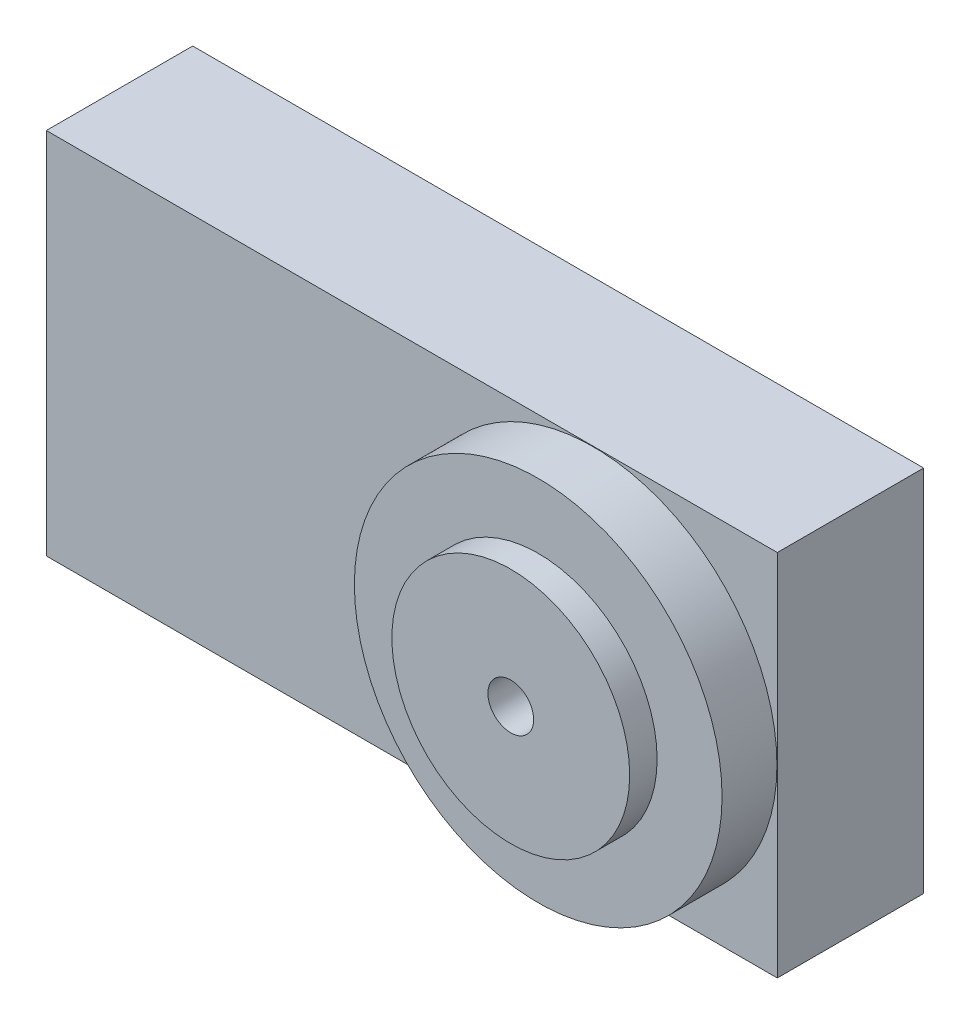
ISO-10303-21;
HEADER;
FILE_DESCRIPTION(('STEP AP214'),'2;1');
FILE_NAME('part.step','',(''),(''),'','','');
FILE_SCHEMA(('AUTOMOTIVE_DESIGN { 1 0 10303 214 1 1 1 1 }'));
ENDSEC;
DATA;
#1=APPLICATION_CONTEXT('core data for automotive mechanical design processes');
#2=APPLICATION_PROTOCOL_DEFINITION('international standard','automotive_design',2000,#1);
#3=PRODUCT_CONTEXT('',#1,'mechanical');
#4=PRODUCT('Part','Part','',(#3));
#5=PRODUCT_RELATED_PRODUCT_CATEGORY('part','',(#4));
#6=PRODUCT_DEFINITION_FORMATION('','',#4);
#7=PRODUCT_DEFINITION_CONTEXT('part definition',#1,'design');
#8=PRODUCT_DEFINITION('design','',#6,#7);
#9=PRODUCT_DEFINITION_SHAPE('','',#8);
#10=(LENGTH_UNIT() NAMED_UNIT(*) SI_UNIT(.MILLI.,.METRE.));
#11=(NAMED_UNIT(*) PLANE_ANGLE_UNIT() SI_UNIT($,.RADIAN.));
#12=(NAMED_UNIT(*) SI_UNIT($,.STERADIAN.) SOLID_ANGLE_UNIT());
#13=UNCERTAINTY_MEASURE_WITH_UNIT(LENGTH_MEASURE(1.E-05),#10,'distance_accuracy_value','');
#14=(GEOMETRIC_REPRESENTATION_CONTEXT(3) GLOBAL_UNCERTAINTY_ASSIGNED_CONTEXT((#13)) GLOBAL_UNIT_ASSIGNED_CONTEXT((#10,
#11,#12)) REPRESENTATION_CONTEXT('',''));
#15=CARTESIAN_POINT('',(0.,0.,0.));
#16=DIRECTION('',(0.,0.,1.));
#17=DIRECTION('',(1.,0.,0.));
#18=AXIS2_PLACEMENT_3D('',#15,#16,#17);
#19=CARTESIAN_POINT('',(45.6675485561145,-126.096678602438,8.));
#20=DIRECTION('',(-1.,0.,0.));
#21=DIRECTION('',(0.,0.,1.));
#22=AXIS2_PLACEMENT_3D('',#19,#20,#21);
#23=PLANE('',#22);
#24=DIRECTION('',(0.,1.,0.));
#25=VECTOR('',#24,1.);
#26=CARTESIAN_POINT('',(45.6675485561145,-126.096678602438,0.));
#27=LINE('',#26,#25);
#28=CARTESIAN_POINT('',(45.6675485561145,-126.096678602438,0.));
#29=VERTEX_POINT('',#28);
#30=CARTESIAN_POINT('',(45.6675485561145,-105.95309397634,0.));
#31=VERTEX_POINT('',#30);
#32=EDGE_CURVE('E101',#29,#31,#27,.T.);
#33=ORIENTED_EDGE('',*,*,#32,.T.);
#34=DIRECTION('',(0.,0.,-1.));
#35=VECTOR('',#34,1.);
#36=CARTESIAN_POINT('',(45.6675485561145,-105.95309397634,8.));
#37=LINE('',#36,#35);
#38=CARTESIAN_POINT('',(45.6675485561145,-105.95309397634,8.));
#39=VERTEX_POINT('',#38);
#40=EDGE_CURVE('E37',#39,#31,#37,.T.);
#41=ORIENTED_EDGE('',*,*,#40,.F.);
#42=DIRECTION('',(0.,1.,0.));
#43=VECTOR('',#42,1.);
#44=CARTESIAN_POINT('',(45.6675485561145,-126.096678602438,8.));
#45=LINE('',#44,#43);
#46=CARTESIAN_POINT('',(45.6675485561145,-126.096678602438,8.));
#47=VERTEX_POINT('',#46);
#48=EDGE_CURVE('E88',#47,#39,#45,.T.);
#49=ORIENTED_EDGE('',*,*,#48,.F.);
#50=DIRECTION('',(0.,0.,-1.));
#51=VECTOR('',#50,1.);
#52=CARTESIAN_POINT('',(45.6675485561145,-126.096678602438,8.));
#53=LINE('',#52,#51);
#54=EDGE_CURVE('E97',#47,#29,#53,.T.);
#55=ORIENTED_EDGE('',*,*,#54,.T.);
#56=EDGE_LOOP('',(#33,#41,#49,#55));
#57=FACE_BOUND('',#56,.T.);
#58=ADVANCED_FACE('F34',(#57),#23,.F.);
#59=CARTESIAN_POINT('',(45.6675485561145,-105.95309397634,8.));
#60=DIRECTION('',(0.,-1.,0.));
#61=DIRECTION('',(0.,0.,-1.));
#62=AXIS2_PLACEMENT_3D('',#59,#60,#61);
#63=PLANE('',#62);
#64=DIRECTION('',(-1.,0.,0.));
#65=VECTOR('',#64,1.);
#66=CARTESIAN_POINT('',(45.6675485561145,-105.95309397634,0.));
#67=LINE('',#66,#65);
#68=CARTESIAN_POINT('',(5.70942067777518,-105.95309397634,0.));
#69=VERTEX_POINT('',#68);
#70=EDGE_CURVE('E93',#31,#69,#67,.T.);
#71=ORIENTED_EDGE('',*,*,#70,.T.);
#72=DIRECTION('',(0.,0.,-1.));
#73=VECTOR('',#72,1.);
#74=CARTESIAN_POINT('',(5.70942067777518,-105.95309397634,8.));
#75=LINE('',#74,#73);
#76=CARTESIAN_POINT('',(5.70942067777518,-105.95309397634,8.));
#77=VERTEX_POINT('',#76);
#78=EDGE_CURVE('E91',#77,#69,#75,.T.);
#79=ORIENTED_EDGE('',*,*,#78,.F.);
#80=DIRECTION('',(-1.,0.,0.));
#81=VECTOR('',#80,1.);
#82=CARTESIAN_POINT('',(45.6675485561145,-105.95309397634,8.));
#83=LINE('',#82,#81);
#84=EDGE_CURVE('E83',#39,#77,#83,.T.);
#85=ORIENTED_EDGE('',*,*,#84,.F.);
#86=ORIENTED_EDGE('',*,*,#40,.T.);
#87=EDGE_LOOP('',(#71,#79,#85,#86));
#88=FACE_BOUND('',#87,.T.);
#89=ADVANCED_FACE('F92',(#88),#63,.F.);
#90=CARTESIAN_POINT('',(5.70942067777518,-126.096678602438,8.));
#91=DIRECTION('',(1.,0.,0.));
#92=DIRECTION('',(0.,0.,-1.));
#93=AXIS2_PLACEMENT_3D('',#90,#91,#92);
#94=PLANE('',#93);
#95=DIRECTION('',(0.,-1.,0.));
#96=VECTOR('',#95,1.);
#97=CARTESIAN_POINT('',(5.70942067777518,-126.096678602438,0.));
#98=LINE('',#97,#96);
#99=CARTESIAN_POINT('',(5.70942067777518,-126.096678602438,0.));
#100=VERTEX_POINT('',#99);
#101=EDGE_CURVE('E69',#69,#100,#98,.T.);
#102=ORIENTED_EDGE('',*,*,#101,.T.);
#103=DIRECTION('',(0.,0.,-1.));
#104=VECTOR('',#103,1.);
#105=CARTESIAN_POINT('',(5.70942067777518,-126.096678602438,8.));
#106=LINE('',#105,#104);
#107=CARTESIAN_POINT('',(5.70942067777518,-126.096678602438,8.));
#108=VERTEX_POINT('',#107);
#109=EDGE_CURVE('E94',#108,#100,#106,.T.);
#110=ORIENTED_EDGE('',*,*,#109,.F.);
#111=DIRECTION('',(0.,-1.,0.));
#112=VECTOR('',#111,1.);
#113=CARTESIAN_POINT('',(5.70942067777518,-126.096678602438,8.));
#114=LINE('',#113,#112);
#115=EDGE_CURVE('E86',#77,#108,#114,.T.);
#116=ORIENTED_EDGE('',*,*,#115,.F.);
#117=ORIENTED_EDGE('',*,*,#78,.T.);
#118=EDGE_LOOP('',(#102,#110,#116,#117));
#119=FACE_BOUND('',#118,.T.);
#120=ADVANCED_FACE('F95',(#119),#94,.F.);
#121=CARTESIAN_POINT('',(45.6675485561145,-126.096678602438,8.));
#122=DIRECTION('',(0.,1.,0.));
#123=DIRECTION('',(0.,0.,1.));
#124=AXIS2_PLACEMENT_3D('',#121,#122,#123);
#125=PLANE('',#124);
#126=DIRECTION('',(1.,0.,0.));
#127=VECTOR('',#126,1.);
#128=CARTESIAN_POINT('',(45.6675485561145,-126.096678602438,0.));
#129=LINE('',#128,#127);
#130=EDGE_CURVE('E75',#100,#29,#129,.T.);
#131=ORIENTED_EDGE('',*,*,#130,.T.);
#132=ORIENTED_EDGE('',*,*,#54,.F.);
#133=DIRECTION('',(1.,0.,0.));
#134=VECTOR('',#133,1.);
#135=CARTESIAN_POINT('',(45.6675485561145,-126.096678602438,8.));
#136=LINE('',#135,#134);
#137=EDGE_CURVE('E52',#108,#47,#136,.T.);
#138=ORIENTED_EDGE('',*,*,#137,.F.);
#139=ORIENTED_EDGE('',*,*,#109,.T.);
#140=EDGE_LOOP('',(#131,#132,#138,#139));
#141=FACE_BOUND('',#140,.T.);
#142=ADVANCED_FACE('F109',(#141),#125,.F.);
#143=CARTESIAN_POINT('',(0.,0.,8.));
#144=DIRECTION('',(0.,0.,1.));
#145=DIRECTION('',(1.,0.,0.));
#146=AXIS2_PLACEMENT_3D('',#143,#144,#145);
#147=PLANE('',#146);
#148=CARTESIAN_POINT('',(35.5975485561146,-116.024886289389,8.));
#149=DIRECTION('',(0.,0.,1.));
#150=DIRECTION('',(1.,0.,0.));
#151=AXIS2_PLACEMENT_3D('',#148,#149,#150);
#152=CIRCLE('',#151,10.0497806213995);
#153=CARTESIAN_POINT('',(45.647329177514,-116.024886289389,8.));
#154=VERTEX_POINT('',#153);
#155=EDGE_CURVE('E43',#154,#154,#152,.T.);
#156=ORIENTED_EDGE('',*,*,#155,.F.);
#157=EDGE_LOOP('',(#156));
#158=FACE_BOUND('',#157,.T.);
#159=ORIENTED_EDGE('',*,*,#48,.T.);
#160=ORIENTED_EDGE('',*,*,#84,.T.);
#161=ORIENTED_EDGE('',*,*,#115,.T.);
#162=ORIENTED_EDGE('',*,*,#137,.T.);
#163=EDGE_LOOP('',(#159,#160,#161,#162));
#164=FACE_BOUND('',#163,.T.);
#165=ADVANCED_FACE('F84',(#158,#164),#147,.T.);
#166=CARTESIAN_POINT('',(0.,0.,0.));
#167=DIRECTION('',(0.,0.,1.));
#168=DIRECTION('',(1.,0.,0.));
#169=AXIS2_PLACEMENT_3D('',#166,#167,#168);
#170=PLANE('',#169);
#171=ORIENTED_EDGE('',*,*,#32,.F.);
#172=ORIENTED_EDGE('',*,*,#130,.F.);
#173=ORIENTED_EDGE('',*,*,#101,.F.);
#174=ORIENTED_EDGE('',*,*,#70,.F.);
#175=EDGE_LOOP('',(#171,#172,#173,#174));
#176=FACE_BOUND('',#175,.T.);
#177=ADVANCED_FACE('F112',(#176),#170,.F.);
#178=CARTESIAN_POINT('',(35.5975485561146,-116.024886289389,11.));
#179=DIRECTION('',(0.,0.,-1.));
#180=DIRECTION('',(-1.,0.,0.));
#181=AXIS2_PLACEMENT_3D('',#178,#179,#180);
#182=CYLINDRICAL_SURFACE('',#181,10.0497806213995);
#183=CARTESIAN_POINT('',(35.5975485561146,-116.024886289389,11.));
#184=DIRECTION('',(0.,0.,1.));
#185=DIRECTION('',(1.,0.,0.));
#186=AXIS2_PLACEMENT_3D('',#183,#184,#185);
#187=CIRCLE('',#186,10.0497806213995);
#188=CARTESIAN_POINT('',(45.647329177514,-116.024886289389,11.));
#189=VERTEX_POINT('',#188);
#190=EDGE_CURVE('E104',#189,#189,#187,.T.);
#191=ORIENTED_EDGE('',*,*,#190,.F.);
#192=EDGE_LOOP('',(#191));
#193=FACE_BOUND('',#192,.T.);
#194=ORIENTED_EDGE('',*,*,#155,.T.);
#195=EDGE_LOOP('',(#194));
#196=FACE_BOUND('',#195,.T.);
#197=ADVANCED_FACE('F152',(#193,#196),#182,.T.);
#198=CARTESIAN_POINT('',(35.5975485561146,-116.024886289389,11.));
#199=DIRECTION('',(0.,0.,1.));
#200=DIRECTION('',(1.,0.,0.));
#201=AXIS2_PLACEMENT_3D('',#198,#199,#200);
#202=PLANE('',#201);
#203=CARTESIAN_POINT('',(35.5975485561146,-116.024886289389,11.));
#204=DIRECTION('',(0.,0.,1.));
#205=DIRECTION('',(1.,0.,0.));
#206=AXIS2_PLACEMENT_3D('',#203,#204,#205);
#207=CIRCLE('',#206,6.5);
#208=CARTESIAN_POINT('',(42.0975485561146,-116.024886289389,11.));
#209=VERTEX_POINT('',#208);
#210=EDGE_CURVE('E11',#209,#209,#207,.T.);
#211=ORIENTED_EDGE('',*,*,#210,.F.);
#212=EDGE_LOOP('',(#211));
#213=FACE_BOUND('',#212,.T.);
#214=ORIENTED_EDGE('',*,*,#190,.T.);
#215=EDGE_LOOP('',(#214));
#216=FACE_BOUND('',#215,.T.);
#217=ADVANCED_FACE('F146',(#213,#216),#202,.T.);
#218=CARTESIAN_POINT('',(35.5975485561146,-116.024886289389,12.5));
#219=DIRECTION('',(0.,0.,-1.));
#220=DIRECTION('',(-1.,0.,0.));
#221=AXIS2_PLACEMENT_3D('',#218,#219,#220);
#222=CYLINDRICAL_SURFACE('',#221,6.5);
#223=CARTESIAN_POINT('',(35.5975485561146,-116.024886289389,12.5));
#224=DIRECTION('',(0.,0.,1.));
#225=DIRECTION('',(1.,0.,0.));
#226=AXIS2_PLACEMENT_3D('',#223,#224,#225);
#227=CIRCLE('',#226,6.5);
#228=CARTESIAN_POINT('',(42.0975485561146,-116.024886289389,12.5));
#229=VERTEX_POINT('',#228);
#230=EDGE_CURVE('E118',#229,#229,#227,.T.);
#231=ORIENTED_EDGE('',*,*,#230,.F.);
#232=EDGE_LOOP('',(#231));
#233=FACE_BOUND('',#232,.T.);
#234=ORIENTED_EDGE('',*,*,#210,.T.);
#235=EDGE_LOOP('',(#234));
#236=FACE_BOUND('',#235,.T.);
#237=ADVANCED_FACE('F140',(#233,#236),#222,.T.);
#238=CARTESIAN_POINT('',(35.5975485561146,-116.024886289389,12.5));
#239=DIRECTION('',(0.,0.,1.));
#240=DIRECTION('',(1.,0.,0.));
#241=AXIS2_PLACEMENT_3D('',#238,#239,#240);
#242=PLANE('',#241);
#243=CARTESIAN_POINT('',(35.5975485561146,-116.024886289389,12.5));
#244=DIRECTION('',(0.,0.,1.));
#245=DIRECTION('',(1.,0.,0.));
#246=AXIS2_PLACEMENT_3D('',#243,#244,#245);
#247=CIRCLE('',#246,1.25);
#248=CARTESIAN_POINT('',(36.8475485561146,-116.024886289389,12.5));
#249=VERTEX_POINT('',#248);
#250=EDGE_CURVE('E123',#249,#249,#247,.T.);
#251=ORIENTED_EDGE('',*,*,#250,.F.);
#252=EDGE_LOOP('',(#251));
#253=FACE_BOUND('',#252,.T.);
#254=ORIENTED_EDGE('',*,*,#230,.T.);
#255=EDGE_LOOP('',(#254));
#256=FACE_BOUND('',#255,.T.);
#257=ADVANCED_FACE('F134',(#253,#256),#242,.T.);
#258=CARTESIAN_POINT('',(35.5975485561146,-116.024886289389,7.5));
#259=DIRECTION('',(0.,0.,1.));
#260=DIRECTION('',(1.,0.,0.));
#261=AXIS2_PLACEMENT_3D('',#258,#259,#260);
#262=CYLINDRICAL_SURFACE('',#261,1.25);
#263=CARTESIAN_POINT('',(35.5975485561146,-116.024886289389,7.5));
#264=DIRECTION('',(0.,0.,1.));
#265=DIRECTION('',(1.,0.,0.));
#266=AXIS2_PLACEMENT_3D('',#263,#264,#265);
#267=CIRCLE('',#266,1.25);
#268=CARTESIAN_POINT('',(36.8475485561146,-116.024886289389,7.5));
#269=VERTEX_POINT('',#268);
#270=EDGE_CURVE('E122',#269,#269,#267,.T.);
#271=ORIENTED_EDGE('',*,*,#270,.F.);
#272=EDGE_LOOP('',(#271));
#273=FACE_BOUND('',#272,.T.);
#274=ORIENTED_EDGE('',*,*,#250,.T.);
#275=EDGE_LOOP('',(#274));
#276=FACE_BOUND('',#275,.T.);
#277=ADVANCED_FACE('F131',(#273,#276),#262,.F.);
#278=CARTESIAN_POINT('',(35.5975485561146,-116.024886289389,7.5));
#279=DIRECTION('',(0.,0.,1.));
#280=DIRECTION('',(1.,0.,0.));
#281=AXIS2_PLACEMENT_3D('',#278,#279,#280);
#282=PLANE('',#281);
#283=ORIENTED_EDGE('',*,*,#270,.T.);
#284=EDGE_LOOP('',(#283));
#285=FACE_BOUND('',#284,.T.);
#286=ADVANCED_FACE('F129',(#285),#282,.T.);
#287=CLOSED_SHELL('',(#58,#89,#120,#142,#165,#177,#197,#217,#237,#257,#277,#286));
#288=MANIFOLD_SOLID_BREP('B2',#287);
#289=ADVANCED_BREP_SHAPE_REPRESENTATION('',(#18,#288),#14);
#290=SHAPE_DEFINITION_REPRESENTATION(#9,#289);
ENDSEC;
END-ISO-10303-21;
